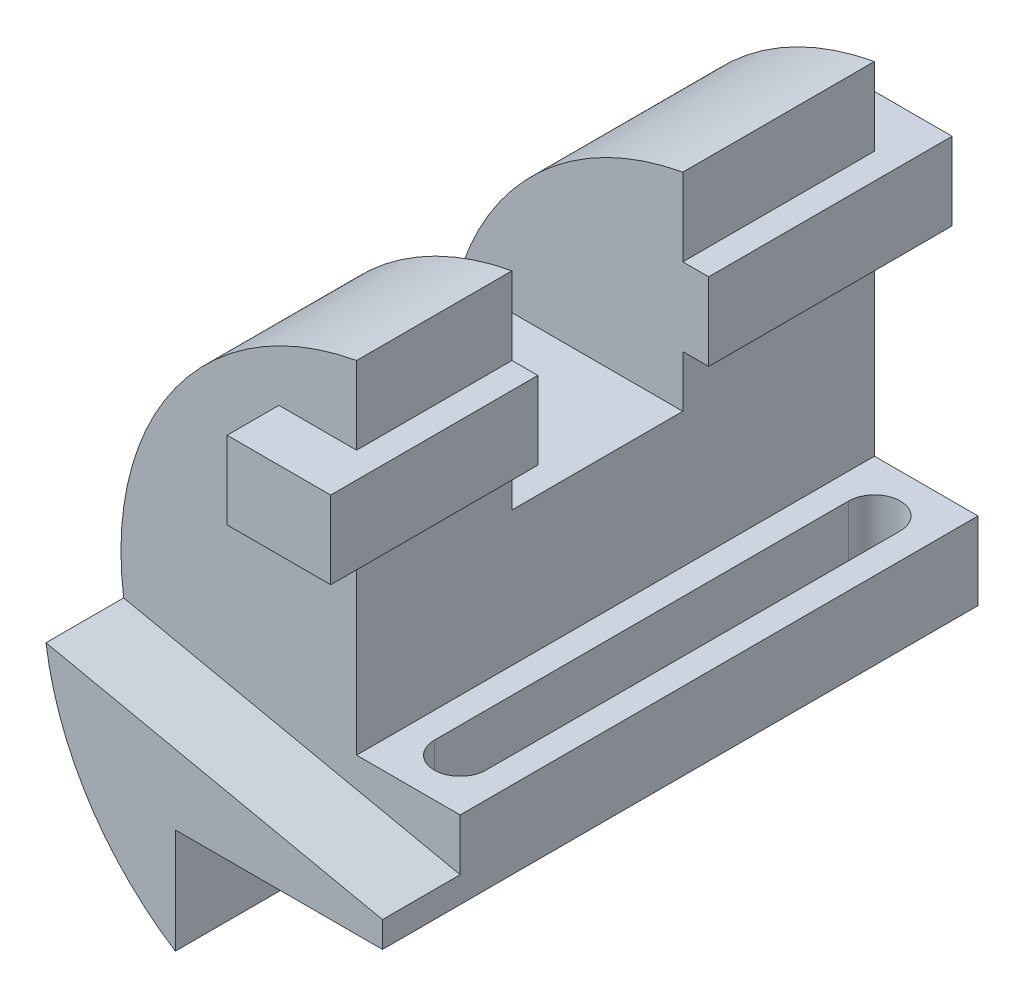
ISO-10303-21;
HEADER;
FILE_DESCRIPTION(('STEP AP214'),'2;1');
FILE_NAME('part.step','',(''),(''),'','','');
FILE_SCHEMA(('AUTOMOTIVE_DESIGN { 1 0 10303 214 1 1 1 1 }'));
ENDSEC;
DATA;
#1=APPLICATION_CONTEXT('core data for automotive mechanical design processes');
#2=APPLICATION_PROTOCOL_DEFINITION('international standard','automotive_design',2000,#1);
#3=PRODUCT_CONTEXT('',#1,'mechanical');
#4=PRODUCT('Part','Part','',(#3));
#5=PRODUCT_RELATED_PRODUCT_CATEGORY('part','',(#4));
#6=PRODUCT_DEFINITION_FORMATION('','',#4);
#7=PRODUCT_DEFINITION_CONTEXT('part definition',#1,'design');
#8=PRODUCT_DEFINITION('design','',#6,#7);
#9=PRODUCT_DEFINITION_SHAPE('','',#8);
#10=(LENGTH_UNIT() NAMED_UNIT(*) SI_UNIT(.MILLI.,.METRE.));
#11=(NAMED_UNIT(*) PLANE_ANGLE_UNIT() SI_UNIT($,.RADIAN.));
#12=(NAMED_UNIT(*) SI_UNIT($,.STERADIAN.) SOLID_ANGLE_UNIT());
#13=UNCERTAINTY_MEASURE_WITH_UNIT(LENGTH_MEASURE(1.E-05),#10,'distance_accuracy_value','');
#14=(GEOMETRIC_REPRESENTATION_CONTEXT(3) GLOBAL_UNCERTAINTY_ASSIGNED_CONTEXT((#13)) GLOBAL_UNIT_ASSIGNED_CONTEXT((#10,
#11,#12)) REPRESENTATION_CONTEXT('',''));
#15=CARTESIAN_POINT('',(0.,0.,0.));
#16=DIRECTION('',(0.,0.,1.));
#17=DIRECTION('',(1.,0.,0.));
#18=AXIS2_PLACEMENT_3D('',#15,#16,#17);
#19=CARTESIAN_POINT('',(-20.,15.,115.));
#20=DIRECTION('',(-1.,0.,0.));
#21=DIRECTION('',(0.,0.,1.));
#22=AXIS2_PLACEMENT_3D('',#19,#20,#21);
#23=PLANE('',#22);
#24=DIRECTION('',(0.,0.,1.));
#25=VECTOR('',#24,1.);
#26=CARTESIAN_POINT('',(-20.,66.,115.));
#27=LINE('',#26,#25);
#28=CARTESIAN_POINT('',(-20.,66.,70.));
#29=VERTEX_POINT('',#28);
#30=CARTESIAN_POINT('',(-20.,66.,100.));
#31=VERTEX_POINT('',#30);
#32=EDGE_CURVE('E317',#29,#31,#27,.T.);
#33=ORIENTED_EDGE('',*,*,#32,.F.);
#34=DIRECTION('',(0.,1.,0.));
#35=VECTOR('',#34,1.);
#36=CARTESIAN_POINT('',(-20.,15.,70.));
#37=LINE('',#36,#35);
#38=CARTESIAN_POINT('',(-20.,81.,70.));
#39=VERTEX_POINT('',#38);
#40=EDGE_CURVE('E267',#29,#39,#37,.T.);
#41=ORIENTED_EDGE('',*,*,#40,.T.);
#42=DIRECTION('',(0.,0.,-1.));
#43=VECTOR('',#42,1.);
#44=CARTESIAN_POINT('',(-20.,81.,115.));
#45=LINE('',#44,#43);
#46=CARTESIAN_POINT('',(-20.,81.,100.));
#47=VERTEX_POINT('',#46);
#48=EDGE_CURVE('E390',#47,#39,#45,.T.);
#49=ORIENTED_EDGE('',*,*,#48,.F.);
#50=DIRECTION('',(0.,1.,0.));
#51=VECTOR('',#50,1.);
#52=CARTESIAN_POINT('',(-20.,15.,100.));
#53=LINE('',#52,#51);
#54=EDGE_CURVE('E340',#31,#47,#53,.T.);
#55=ORIENTED_EDGE('',*,*,#54,.F.);
#56=EDGE_LOOP('',(#33,#41,#49,#55));
#57=FACE_BOUND('',#56,.T.);
#58=ADVANCED_FACE('F41',(#57),#23,.F.);
#59=CARTESIAN_POINT('',(-15.,66.,-10.));
#60=DIRECTION('',(-1.,0.,0.));
#61=DIRECTION('',(0.,0.,1.));
#62=AXIS2_PLACEMENT_3D('',#59,#60,#61);
#63=PLANE('',#62);
#64=DIRECTION('',(0.,1.,0.));
#65=VECTOR('',#64,1.);
#66=CARTESIAN_POINT('',(-15.,66.,110.));
#67=LINE('',#66,#65);
#68=CARTESIAN_POINT('',(-15.,51.,110.));
#69=VERTEX_POINT('',#68);
#70=CARTESIAN_POINT('',(-15.,66.,110.));
#71=VERTEX_POINT('',#70);
#72=EDGE_CURVE('E288',#69,#71,#67,.T.);
#73=ORIENTED_EDGE('',*,*,#72,.F.);
#74=DIRECTION('',(0.,0.,1.));
#75=VECTOR('',#74,1.);
#76=CARTESIAN_POINT('',(-15.,51.,-10.));
#77=LINE('',#76,#75);
#78=CARTESIAN_POINT('',(-15.,51.,70.));
#79=VERTEX_POINT('',#78);
#80=EDGE_CURVE('E314',#79,#69,#77,.T.);
#81=ORIENTED_EDGE('',*,*,#80,.F.);
#82=DIRECTION('',(0.,1.,0.));
#83=VECTOR('',#82,1.);
#84=CARTESIAN_POINT('',(-15.,66.,70.));
#85=LINE('',#84,#83);
#86=CARTESIAN_POINT('',(-15.,66.,70.));
#87=VERTEX_POINT('',#86);
#88=EDGE_CURVE('E264',#79,#87,#85,.T.);
#89=ORIENTED_EDGE('',*,*,#88,.T.);
#90=DIRECTION('',(0.,0.,1.));
#91=VECTOR('',#90,1.);
#92=CARTESIAN_POINT('',(-15.,66.,-10.));
#93=LINE('',#92,#91);
#94=EDGE_CURVE('E303',#87,#71,#93,.T.);
#95=ORIENTED_EDGE('',*,*,#94,.T.);
#96=EDGE_LOOP('',(#73,#81,#89,#95));
#97=FACE_BOUND('',#96,.T.);
#98=ADVANCED_FACE('F440',(#97),#63,.F.);
#99=CARTESIAN_POINT('',(-15.,51.,-10.));
#100=DIRECTION('',(0.,1.,0.));
#101=DIRECTION('',(-1.,0.,0.));
#102=AXIS2_PLACEMENT_3D('',#99,#100,#101);
#103=PLANE('',#102);
#104=DIRECTION('',(0.,0.,-1.));
#105=VECTOR('',#104,1.);
#106=CARTESIAN_POINT('',(-20.,51.,115.));
#107=LINE('',#106,#105);
#108=CARTESIAN_POINT('',(-20.,51.,100.));
#109=VERTEX_POINT('',#108);
#110=CARTESIAN_POINT('',(-20.,51.,70.));
#111=VERTEX_POINT('',#110);
#112=EDGE_CURVE('E328',#109,#111,#107,.T.);
#113=ORIENTED_EDGE('',*,*,#112,.T.);
#114=DIRECTION('',(1.,0.,0.));
#115=VECTOR('',#114,1.);
#116=CARTESIAN_POINT('',(-15.,51.,70.));
#117=LINE('',#116,#115);
#118=EDGE_CURVE('E270',#111,#79,#117,.T.);
#119=ORIENTED_EDGE('',*,*,#118,.T.);
#120=ORIENTED_EDGE('',*,*,#80,.T.);
#121=DIRECTION('',(1.,0.,0.));
#122=VECTOR('',#121,1.);
#123=CARTESIAN_POINT('',(-15.,51.,110.));
#124=LINE('',#123,#122);
#125=CARTESIAN_POINT('',(-35.,51.,110.));
#126=VERTEX_POINT('',#125);
#127=EDGE_CURVE('E291',#126,#69,#124,.T.);
#128=ORIENTED_EDGE('',*,*,#127,.F.);
#129=DIRECTION('',(0.,0.,1.));
#130=VECTOR('',#129,1.);
#131=CARTESIAN_POINT('',(-35.,51.,-10.));
#132=LINE('',#131,#130);
#133=CARTESIAN_POINT('',(-35.,51.,100.));
#134=VERTEX_POINT('',#133);
#135=EDGE_CURVE('E310',#134,#126,#132,.T.);
#136=ORIENTED_EDGE('',*,*,#135,.F.);
#137=DIRECTION('',(-1.,0.,0.));
#138=VECTOR('',#137,1.);
#139=CARTESIAN_POINT('',(-10.,51.,100.));
#140=LINE('',#139,#138);
#141=EDGE_CURVE('E403',#109,#134,#140,.T.);
#142=ORIENTED_EDGE('',*,*,#141,.F.);
#143=EDGE_LOOP('',(#113,#119,#120,#128,#136,#142));
#144=FACE_BOUND('',#143,.T.);
#145=ADVANCED_FACE('F450',(#144),#103,.F.);
#146=CARTESIAN_POINT('',(-15.,66.,-10.));
#147=DIRECTION('',(0.,-1.,0.));
#148=DIRECTION('',(0.,0.,-1.));
#149=AXIS2_PLACEMENT_3D('',#146,#147,#148);
#150=PLANE('',#149);
#151=ORIENTED_EDGE('',*,*,#94,.F.);
#152=DIRECTION('',(-1.,0.,0.));
#153=VECTOR('',#152,1.);
#154=CARTESIAN_POINT('',(-15.,66.,70.));
#155=LINE('',#154,#153);
#156=EDGE_CURVE('E409',#87,#29,#155,.T.);
#157=ORIENTED_EDGE('',*,*,#156,.T.);
#158=ORIENTED_EDGE('',*,*,#32,.T.);
#159=DIRECTION('',(1.,0.,0.));
#160=VECTOR('',#159,1.);
#161=CARTESIAN_POINT('',(-10.,66.,100.));
#162=LINE('',#161,#160);
#163=CARTESIAN_POINT('',(-35.,66.,100.));
#164=VERTEX_POINT('',#163);
#165=EDGE_CURVE('E397',#164,#31,#162,.T.);
#166=ORIENTED_EDGE('',*,*,#165,.F.);
#167=DIRECTION('',(0.,0.,1.));
#168=VECTOR('',#167,1.);
#169=CARTESIAN_POINT('',(-35.,66.,-10.));
#170=LINE('',#169,#168);
#171=CARTESIAN_POINT('',(-35.,66.,110.));
#172=VERTEX_POINT('',#171);
#173=EDGE_CURVE('E306',#164,#172,#170,.T.);
#174=ORIENTED_EDGE('',*,*,#173,.T.);
#175=DIRECTION('',(-1.,0.,0.));
#176=VECTOR('',#175,1.);
#177=CARTESIAN_POINT('',(-15.,66.,110.));
#178=LINE('',#177,#176);
#179=EDGE_CURVE('E285',#71,#172,#178,.T.);
#180=ORIENTED_EDGE('',*,*,#179,.F.);
#181=EDGE_LOOP('',(#151,#157,#158,#166,#174,#180));
#182=FACE_BOUND('',#181,.T.);
#183=ADVANCED_FACE('F459',(#182),#150,.F.);
#184=DIRECTION('',(0.,0.,1.));
#185=VECTOR('',#184,1.);
#186=CARTESIAN_POINT('',(-20.,41.,115.));
#187=LINE('',#186,#185);
#188=CARTESIAN_POINT('',(-20.,41.,37.));
#189=VERTEX_POINT('',#188);
#190=CARTESIAN_POINT('',(-20.,41.,70.));
#191=VERTEX_POINT('',#190);
#192=EDGE_CURVE('E279',#189,#191,#187,.T.);
#193=ORIENTED_EDGE('',*,*,#192,.T.);
#194=DIRECTION('',(0.,1.,0.));
#195=VECTOR('',#194,1.);
#196=CARTESIAN_POINT('',(-20.,15.,70.));
#197=LINE('',#196,#195);
#198=EDGE_CURVE('E276',#191,#111,#197,.T.);
#199=ORIENTED_EDGE('',*,*,#198,.T.);
#200=ORIENTED_EDGE('',*,*,#112,.F.);
#201=CARTESIAN_POINT('',(-20.,15.,100.));
#202=VERTEX_POINT('',#201);
#203=EDGE_CURVE('E341',#202,#109,#53,.T.);
#204=ORIENTED_EDGE('',*,*,#203,.F.);
#205=DIRECTION('',(0.,0.,-1.));
#206=VECTOR('',#205,1.);
#207=CARTESIAN_POINT('',(-20.,15.,115.));
#208=LINE('',#207,#206);
#209=CARTESIAN_POINT('',(-20.,15.,0.));
#210=VERTEX_POINT('',#209);
#211=EDGE_CURVE('E393',#202,#210,#208,.T.);
#212=ORIENTED_EDGE('',*,*,#211,.T.);
#213=DIRECTION('',(0.,1.,0.));
#214=VECTOR('',#213,1.);
#215=CARTESIAN_POINT('',(-20.,15.,0.));
#216=LINE('',#215,#214);
#217=CARTESIAN_POINT('',(-20.,51.,0.));
#218=VERTEX_POINT('',#217);
#219=EDGE_CURVE('E373',#210,#218,#216,.T.);
#220=ORIENTED_EDGE('',*,*,#219,.T.);
#221=CARTESIAN_POINT('',(-20.,51.,37.));
#222=VERTEX_POINT('',#221);
#223=EDGE_CURVE('E327',#222,#218,#107,.T.);
#224=ORIENTED_EDGE('',*,*,#223,.F.);
#225=DIRECTION('',(0.,-1.,0.));
#226=VECTOR('',#225,1.);
#227=CARTESIAN_POINT('',(-20.,15.,37.));
#228=LINE('',#227,#226);
#229=EDGE_CURVE('E261',#222,#189,#228,.T.);
#230=ORIENTED_EDGE('',*,*,#229,.T.);
#231=EDGE_LOOP('',(#193,#199,#200,#204,#212,#220,#224,#230));
#232=FACE_BOUND('',#231,.T.);
#233=ADVANCED_FACE('F444',(#232),#23,.F.);
#234=CARTESIAN_POINT('',(-20.,81.,37.));
#235=VERTEX_POINT('',#234);
#236=CARTESIAN_POINT('',(-20.,81.,0.));
#237=VERTEX_POINT('',#236);
#238=EDGE_CURVE('E389',#235,#237,#45,.T.);
#239=ORIENTED_EDGE('',*,*,#238,.F.);
#240=DIRECTION('',(0.,-1.,0.));
#241=VECTOR('',#240,1.);
#242=CARTESIAN_POINT('',(-20.,15.,37.));
#243=LINE('',#242,#241);
#244=CARTESIAN_POINT('',(-20.,66.,37.));
#245=VERTEX_POINT('',#244);
#246=EDGE_CURVE('E252',#235,#245,#243,.T.);
#247=ORIENTED_EDGE('',*,*,#246,.T.);
#248=CARTESIAN_POINT('',(-20.,66.,0.));
#249=VERTEX_POINT('',#248);
#250=EDGE_CURVE('E318',#249,#245,#27,.T.);
#251=ORIENTED_EDGE('',*,*,#250,.F.);
#252=EDGE_CURVE('E372',#249,#237,#216,.T.);
#253=ORIENTED_EDGE('',*,*,#252,.T.);
#254=EDGE_LOOP('',(#239,#247,#251,#253));
#255=FACE_BOUND('',#254,.T.);
#256=ADVANCED_FACE('F443',(#255),#23,.F.);
#257=CARTESIAN_POINT('',(-10.,26.4083339693685,0.));
#258=DIRECTION('',(0.,0.,-1.));
#259=DIRECTION('',(-1.,0.,0.));
#260=AXIS2_PLACEMENT_3D('',#257,#258,#259);
#261=PLANE('',#260);
#262=DIRECTION('',(0.,-1.,0.));
#263=VECTOR('',#262,1.);
#264=CARTESIAN_POINT('',(-35.,26.4083339693685,0.));
#265=LINE('',#264,#263);
#266=CARTESIAN_POINT('',(-35.,66.,0.));
#267=VERTEX_POINT('',#266);
#268=CARTESIAN_POINT('',(-35.,51.,0.));
#269=VERTEX_POINT('',#268);
#270=EDGE_CURVE('E324',#267,#269,#265,.T.);
#271=ORIENTED_EDGE('',*,*,#270,.T.);
#272=DIRECTION('',(1.,0.,0.));
#273=VECTOR('',#272,1.);
#274=CARTESIAN_POINT('',(-10.,51.,0.));
#275=LINE('',#274,#273);
#276=EDGE_CURVE('E331',#269,#218,#275,.T.);
#277=ORIENTED_EDGE('',*,*,#276,.T.);
#278=ORIENTED_EDGE('',*,*,#219,.F.);
#279=DIRECTION('',(-1.,0.,0.));
#280=VECTOR('',#279,1.);
#281=CARTESIAN_POINT('',(0.,15.,0.));
#282=LINE('',#281,#280);
#283=CARTESIAN_POINT('',(0.,15.,0.));
#284=VERTEX_POINT('',#283);
#285=EDGE_CURVE('E369',#284,#210,#282,.T.);
#286=ORIENTED_EDGE('',*,*,#285,.F.);
#287=DIRECTION('',(0.,1.,0.));
#288=VECTOR('',#287,1.);
#289=CARTESIAN_POINT('',(0.,0.,0.));
#290=LINE('',#289,#288);
#291=CARTESIAN_POINT('',(0.,0.,0.));
#292=VERTEX_POINT('',#291);
#293=EDGE_CURVE('E355',#292,#284,#290,.T.);
#294=ORIENTED_EDGE('',*,*,#293,.F.);
#295=DIRECTION('',(1.,0.,0.));
#296=VECTOR('',#295,1.);
#297=CARTESIAN_POINT('',(0.,0.,0.));
#298=LINE('',#297,#296);
#299=CARTESIAN_POINT('',(-40.,0.,0.));
#300=VERTEX_POINT('',#299);
#301=EDGE_CURVE('E360',#300,#292,#298,.T.);
#302=ORIENTED_EDGE('',*,*,#301,.F.);
#303=DIRECTION('',(0.,1.,0.));
#304=VECTOR('',#303,1.);
#305=CARTESIAN_POINT('',(-40.,0.,0.));
#306=LINE('',#305,#304);
#307=CARTESIAN_POINT('',(-40.,-20.2848132794516,0.));
#308=VERTEX_POINT('',#307);
#309=EDGE_CURVE('E378',#308,#300,#306,.T.);
#310=ORIENTED_EDGE('',*,*,#309,.F.);
#311=CARTESIAN_POINT('',(-10.,26.4083339693685,0.));
#312=DIRECTION('',(0.,0.,1.));
#313=DIRECTION('',(-1.,0.,0.));
#314=AXIS2_PLACEMENT_3D('',#311,#312,#313);
#315=CIRCLE('',#314,55.5);
#316=EDGE_CURVE('E376',#237,#308,#315,.T.);
#317=ORIENTED_EDGE('',*,*,#316,.F.);
#318=ORIENTED_EDGE('',*,*,#252,.F.);
#319=DIRECTION('',(-1.,0.,0.));
#320=VECTOR('',#319,1.);
#321=CARTESIAN_POINT('',(-10.,66.,0.));
#322=LINE('',#321,#320);
#323=EDGE_CURVE('E321',#249,#267,#322,.T.);
#324=ORIENTED_EDGE('',*,*,#323,.T.);
#325=EDGE_LOOP('',(#271,#277,#278,#286,#294,#302,#310,#317,#318,#324));
#326=FACE_BOUND('',#325,.T.);
#327=ADVANCED_FACE('F457',(#326),#261,.T.);
#328=CARTESIAN_POINT('',(-10.,26.4083339693685,100.));
#329=DIRECTION('',(0.,0.,1.));
#330=DIRECTION('',(1.,0.,0.));
#331=AXIS2_PLACEMENT_3D('',#328,#329,#330);
#332=PLANE('',#331);
#333=ORIENTED_EDGE('',*,*,#203,.T.);
#334=ORIENTED_EDGE('',*,*,#141,.T.);
#335=DIRECTION('',(0.,1.,0.));
#336=VECTOR('',#335,1.);
#337=CARTESIAN_POINT('',(-35.,26.4083339693685,100.));
#338=LINE('',#337,#336);
#339=EDGE_CURVE('E400',#134,#164,#338,.T.);
#340=ORIENTED_EDGE('',*,*,#339,.T.);
#341=ORIENTED_EDGE('',*,*,#165,.T.);
#342=ORIENTED_EDGE('',*,*,#54,.T.);
#343=CARTESIAN_POINT('',(-10.,26.4083339693685,100.));
#344=DIRECTION('',(0.,0.,1.));
#345=DIRECTION('',(1.,0.,0.));
#346=AXIS2_PLACEMENT_3D('',#343,#344,#345);
#347=CIRCLE('',#346,55.5);
#348=CARTESIAN_POINT('',(-64.9776030366009,18.8114158870193,100.));
#349=VERTEX_POINT('',#348);
#350=EDGE_CURVE('E337',#47,#349,#347,.T.);
#351=ORIENTED_EDGE('',*,*,#350,.T.);
#352=DIRECTION('',(-0.978147600733806,0.207911690817756,0.));
#353=VECTOR('',#352,1.);
#354=CARTESIAN_POINT('',(0.,5.,100.));
#355=LINE('',#354,#353);
#356=CARTESIAN_POINT('',(0.,5.,100.));
#357=VERTEX_POINT('',#356);
#358=EDGE_CURVE('E335',#357,#349,#355,.T.);
#359=ORIENTED_EDGE('',*,*,#358,.F.);
#360=DIRECTION('',(0.,1.,0.));
#361=VECTOR('',#360,1.);
#362=CARTESIAN_POINT('',(0.,5.,100.));
#363=LINE('',#362,#361);
#364=CARTESIAN_POINT('',(0.,15.,100.));
#365=VERTEX_POINT('',#364);
#366=EDGE_CURVE('E346',#357,#365,#363,.T.);
#367=ORIENTED_EDGE('',*,*,#366,.T.);
#368=DIRECTION('',(-1.,0.,0.));
#369=VECTOR('',#368,1.);
#370=CARTESIAN_POINT('',(0.,15.,100.));
#371=LINE('',#370,#369);
#372=EDGE_CURVE('E344',#365,#202,#371,.T.);
#373=ORIENTED_EDGE('',*,*,#372,.T.);
#374=EDGE_LOOP('',(#333,#334,#340,#341,#342,#351,#359,#367,#373));
#375=FACE_BOUND('',#374,.T.);
#376=ADVANCED_FACE('F504',(#375),#332,.T.);
#377=CARTESIAN_POINT('',(0.,0.,115.));
#378=DIRECTION('',(-1.,0.,0.));
#379=DIRECTION('',(0.,0.,1.));
#380=AXIS2_PLACEMENT_3D('',#377,#378,#379);
#381=PLANE('',#380);
#382=DIRECTION('',(0.,0.,1.));
#383=VECTOR('',#382,1.);
#384=CARTESIAN_POINT('',(0.,5.,100.));
#385=LINE('',#384,#383);
#386=CARTESIAN_POINT('',(0.,5.,115.));
#387=VERTEX_POINT('',#386);
#388=EDGE_CURVE('E348',#357,#387,#385,.T.);
#389=ORIENTED_EDGE('',*,*,#388,.T.);
#390=DIRECTION('',(0.,1.,0.));
#391=VECTOR('',#390,1.);
#392=CARTESIAN_POINT('',(0.,0.,115.));
#393=LINE('',#392,#391);
#394=CARTESIAN_POINT('',(0.,0.,115.));
#395=VERTEX_POINT('',#394);
#396=EDGE_CURVE('E356',#395,#387,#393,.T.);
#397=ORIENTED_EDGE('',*,*,#396,.F.);
#398=DIRECTION('',(0.,0.,-1.));
#399=VECTOR('',#398,1.);
#400=CARTESIAN_POINT('',(0.,0.,115.));
#401=LINE('',#400,#399);
#402=EDGE_CURVE('E366',#395,#292,#401,.T.);
#403=ORIENTED_EDGE('',*,*,#402,.T.);
#404=ORIENTED_EDGE('',*,*,#293,.T.);
#405=DIRECTION('',(0.,0.,-1.));
#406=VECTOR('',#405,1.);
#407=CARTESIAN_POINT('',(0.,15.,115.));
#408=LINE('',#407,#406);
#409=EDGE_CURVE('E395',#365,#284,#408,.T.);
#410=ORIENTED_EDGE('',*,*,#409,.F.);
#411=ORIENTED_EDGE('',*,*,#366,.F.);
#412=EDGE_LOOP('',(#389,#397,#403,#404,#410,#411));
#413=FACE_BOUND('',#412,.T.);
#414=ADVANCED_FACE('F43',(#413),#381,.F.);
#415=CARTESIAN_POINT('',(0.,15.,115.));
#416=DIRECTION('',(0.,-1.,0.));
#417=DIRECTION('',(1.,0.,0.));
#418=AXIS2_PLACEMENT_3D('',#415,#416,#417);
#419=PLANE('',#418);
#420=DIRECTION('',(0.,0.,-1.));
#421=VECTOR('',#420,1.);
#422=CARTESIAN_POINT('',(-15.,15.,115.));
#423=LINE('',#422,#421);
#424=CARTESIAN_POINT('',(-15.,15.,90.));
#425=VERTEX_POINT('',#424);
#426=CARTESIAN_POINT('',(-15.,15.,10.));
#427=VERTEX_POINT('',#426);
#428=EDGE_CURVE('E216',#425,#427,#423,.T.);
#429=ORIENTED_EDGE('',*,*,#428,.T.);
#430=CARTESIAN_POINT('',(-10.,15.,10.));
#431=DIRECTION('',(0.,-1.,0.));
#432=DIRECTION('',(1.,0.,0.));
#433=AXIS2_PLACEMENT_3D('',#430,#431,#432);
#434=CIRCLE('',#433,5.);
#435=CARTESIAN_POINT('',(-4.99999999999999,15.,10.));
#436=VERTEX_POINT('',#435);
#437=EDGE_CURVE('E237',#427,#436,#434,.T.);
#438=ORIENTED_EDGE('',*,*,#437,.T.);
#439=DIRECTION('',(0.,0.,-1.));
#440=VECTOR('',#439,1.);
#441=CARTESIAN_POINT('',(-5.00000000000001,15.,115.));
#442=LINE('',#441,#440);
#443=CARTESIAN_POINT('',(-5.,15.,90.));
#444=VERTEX_POINT('',#443);
#445=EDGE_CURVE('E236',#444,#436,#442,.T.);
#446=ORIENTED_EDGE('',*,*,#445,.F.);
#447=CARTESIAN_POINT('',(-10.,15.,90.));
#448=DIRECTION('',(0.,-1.,0.));
#449=DIRECTION('',(1.,0.,0.));
#450=AXIS2_PLACEMENT_3D('',#447,#448,#449);
#451=CIRCLE('',#450,5.);
#452=EDGE_CURVE('E227',#444,#425,#451,.T.);
#453=ORIENTED_EDGE('',*,*,#452,.T.);
#454=EDGE_LOOP('',(#429,#438,#446,#453));
#455=FACE_BOUND('',#454,.T.);
#456=ORIENTED_EDGE('',*,*,#372,.F.);
#457=ORIENTED_EDGE('',*,*,#409,.T.);
#458=ORIENTED_EDGE('',*,*,#285,.T.);
#459=ORIENTED_EDGE('',*,*,#211,.F.);
#460=EDGE_LOOP('',(#456,#457,#458,#459));
#461=FACE_BOUND('',#460,.T.);
#462=ADVANCED_FACE('F234',(#455,#461),#419,.F.);
#463=CARTESIAN_POINT('',(-10.,26.4083339693685,115.));
#464=DIRECTION('',(0.,0.,-1.));
#465=DIRECTION('',(-1.,0.,0.));
#466=AXIS2_PLACEMENT_3D('',#463,#464,#465);
#467=CYLINDRICAL_SURFACE('',#466,55.5);
#468=ORIENTED_EDGE('',*,*,#48,.T.);
#469=CARTESIAN_POINT('',(-10.,26.4083339693685,70.));
#470=DIRECTION('',(0.,0.,1.));
#471=DIRECTION('',(1.,0.,0.));
#472=AXIS2_PLACEMENT_3D('',#469,#470,#471);
#473=CIRCLE('',#472,55.5);
#474=CARTESIAN_POINT('',(-63.5474862383895,41.,70.));
#475=VERTEX_POINT('',#474);
#476=EDGE_CURVE('E273',#39,#475,#473,.T.);
#477=ORIENTED_EDGE('',*,*,#476,.T.);
#478=DIRECTION('',(0.,0.,-1.));
#479=VECTOR('',#478,1.);
#480=CARTESIAN_POINT('',(-63.5474862383895,41.,115.));
#481=LINE('',#480,#479);
#482=CARTESIAN_POINT('',(-63.5474862383895,41.,37.));
#483=VERTEX_POINT('',#482);
#484=EDGE_CURVE('E412',#475,#483,#481,.T.);
#485=ORIENTED_EDGE('',*,*,#484,.T.);
#486=CARTESIAN_POINT('',(-10.,26.4083339693685,37.));
#487=DIRECTION('',(0.,0.,-1.));
#488=DIRECTION('',(-1.,0.,0.));
#489=AXIS2_PLACEMENT_3D('',#486,#487,#488);
#490=CIRCLE('',#489,55.5);
#491=EDGE_CURVE('E258',#483,#235,#490,.T.);
#492=ORIENTED_EDGE('',*,*,#491,.T.);
#493=ORIENTED_EDGE('',*,*,#238,.T.);
#494=ORIENTED_EDGE('',*,*,#316,.T.);
#495=DIRECTION('',(0.,0.,-1.));
#496=VECTOR('',#495,1.);
#497=CARTESIAN_POINT('',(-40.,-20.2848132794516,115.));
#498=LINE('',#497,#496);
#499=CARTESIAN_POINT('',(-40.,-20.2848132794516,115.));
#500=VERTEX_POINT('',#499);
#501=EDGE_CURVE('E386',#500,#308,#498,.T.);
#502=ORIENTED_EDGE('',*,*,#501,.F.);
#503=CARTESIAN_POINT('',(-10.,26.4083339693685,115.));
#504=DIRECTION('',(0.,0.,1.));
#505=DIRECTION('',(-1.,0.,0.));
#506=AXIS2_PLACEMENT_3D('',#503,#504,#505);
#507=CIRCLE('',#506,55.5);
#508=CARTESIAN_POINT('',(-64.977603036601,18.8114158870193,115.));
#509=VERTEX_POINT('',#508);
#510=EDGE_CURVE('E359',#509,#500,#507,.T.);
#511=ORIENTED_EDGE('',*,*,#510,.F.);
#512=DIRECTION('',(0.,0.,1.));
#513=VECTOR('',#512,1.);
#514=CARTESIAN_POINT('',(-64.9776030366009,18.8114158870193,100.));
#515=LINE('',#514,#513);
#516=EDGE_CURVE('E353',#349,#509,#515,.T.);
#517=ORIENTED_EDGE('',*,*,#516,.F.);
#518=ORIENTED_EDGE('',*,*,#350,.F.);
#519=EDGE_LOOP('',(#468,#477,#485,#492,#493,#494,#502,#511,#517,#518));
#520=FACE_BOUND('',#519,.T.);
#521=ADVANCED_FACE('F478',(#520),#467,.T.);
#522=CARTESIAN_POINT('',(-10.,26.4083339693685,115.));
#523=DIRECTION('',(0.,0.,-1.));
#524=DIRECTION('',(-1.,0.,0.));
#525=AXIS2_PLACEMENT_3D('',#522,#523,#524);
#526=PLANE('',#525);
#527=DIRECTION('',(-0.978147600733806,0.207911690817756,0.));
#528=VECTOR('',#527,1.);
#529=CARTESIAN_POINT('',(0.,5.,115.));
#530=LINE('',#529,#528);
#531=EDGE_CURVE('E334',#387,#509,#530,.T.);
#532=ORIENTED_EDGE('',*,*,#531,.T.);
#533=ORIENTED_EDGE('',*,*,#510,.T.);
#534=DIRECTION('',(0.,1.,0.));
#535=VECTOR('',#534,1.);
#536=CARTESIAN_POINT('',(-40.,0.,115.));
#537=LINE('',#536,#535);
#538=CARTESIAN_POINT('',(-40.,0.,115.));
#539=VERTEX_POINT('',#538);
#540=EDGE_CURVE('E362',#500,#539,#537,.T.);
#541=ORIENTED_EDGE('',*,*,#540,.T.);
#542=DIRECTION('',(1.,0.,0.));
#543=VECTOR('',#542,1.);
#544=CARTESIAN_POINT('',(0.,0.,115.));
#545=LINE('',#544,#543);
#546=EDGE_CURVE('E364',#539,#395,#545,.T.);
#547=ORIENTED_EDGE('',*,*,#546,.T.);
#548=ORIENTED_EDGE('',*,*,#396,.T.);
#549=EDGE_LOOP('',(#532,#533,#541,#547,#548));
#550=FACE_BOUND('',#549,.T.);
#551=ADVANCED_FACE('F494',(#550),#526,.F.);
#552=CARTESIAN_POINT('',(-40.,0.,115.));
#553=DIRECTION('',(-1.,0.,0.));
#554=DIRECTION('',(0.,-1.,0.));
#555=AXIS2_PLACEMENT_3D('',#552,#553,#554);
#556=PLANE('',#555);
#557=ORIENTED_EDGE('',*,*,#309,.T.);
#558=DIRECTION('',(0.,0.,-1.));
#559=VECTOR('',#558,1.);
#560=CARTESIAN_POINT('',(-40.,0.,115.));
#561=LINE('',#560,#559);
#562=EDGE_CURVE('E383',#539,#300,#561,.T.);
#563=ORIENTED_EDGE('',*,*,#562,.F.);
#564=ORIENTED_EDGE('',*,*,#540,.F.);
#565=ORIENTED_EDGE('',*,*,#501,.T.);
#566=EDGE_LOOP('',(#557,#563,#564,#565));
#567=FACE_BOUND('',#566,.T.);
#568=ADVANCED_FACE('F490',(#567),#556,.F.);
#569=CARTESIAN_POINT('',(0.,0.,115.));
#570=DIRECTION('',(0.,1.,0.));
#571=DIRECTION('',(0.,0.,1.));
#572=AXIS2_PLACEMENT_3D('',#569,#570,#571);
#573=PLANE('',#572);
#574=DIRECTION('',(0.,0.,1.));
#575=VECTOR('',#574,1.);
#576=CARTESIAN_POINT('',(-5.,0.,115.));
#577=LINE('',#576,#575);
#578=CARTESIAN_POINT('',(-4.99999999999999,0.,10.));
#579=VERTEX_POINT('',#578);
#580=CARTESIAN_POINT('',(-5.,0.,90.));
#581=VERTEX_POINT('',#580);
#582=EDGE_CURVE('E12',#579,#581,#577,.T.);
#583=ORIENTED_EDGE('',*,*,#582,.F.);
#584=CARTESIAN_POINT('',(-9.99999999999999,0.,10.));
#585=DIRECTION('',(0.,1.,0.));
#586=DIRECTION('',(0.,0.,1.));
#587=AXIS2_PLACEMENT_3D('',#584,#585,#586);
#588=CIRCLE('',#587,5.);
#589=CARTESIAN_POINT('',(-15.,0.,10.));
#590=VERTEX_POINT('',#589);
#591=EDGE_CURVE('E221',#579,#590,#588,.T.);
#592=ORIENTED_EDGE('',*,*,#591,.T.);
#593=DIRECTION('',(0.,0.,1.));
#594=VECTOR('',#593,1.);
#595=CARTESIAN_POINT('',(-15.,0.,115.));
#596=LINE('',#595,#594);
#597=CARTESIAN_POINT('',(-15.,0.,90.));
#598=VERTEX_POINT('',#597);
#599=EDGE_CURVE('E222',#590,#598,#596,.T.);
#600=ORIENTED_EDGE('',*,*,#599,.T.);
#601=CARTESIAN_POINT('',(-10.,0.,90.));
#602=DIRECTION('',(0.,1.,0.));
#603=DIRECTION('',(0.,0.,1.));
#604=AXIS2_PLACEMENT_3D('',#601,#602,#603);
#605=CIRCLE('',#604,5.);
#606=EDGE_CURVE('E49',#598,#581,#605,.T.);
#607=ORIENTED_EDGE('',*,*,#606,.T.);
#608=EDGE_LOOP('',(#583,#592,#600,#607));
#609=FACE_BOUND('',#608,.T.);
#610=ORIENTED_EDGE('',*,*,#301,.T.);
#611=ORIENTED_EDGE('',*,*,#402,.F.);
#612=ORIENTED_EDGE('',*,*,#546,.F.);
#613=ORIENTED_EDGE('',*,*,#562,.T.);
#614=EDGE_LOOP('',(#610,#611,#612,#613));
#615=FACE_BOUND('',#614,.T.);
#616=ADVANCED_FACE('F416',(#609,#615),#573,.F.);
#617=CARTESIAN_POINT('',(0.,5.,100.));
#618=DIRECTION('',(0.207911690817756,0.978147600733806,0.));
#619=DIRECTION('',(-0.978147600733806,0.207911690817756,0.));
#620=AXIS2_PLACEMENT_3D('',#617,#618,#619);
#621=PLANE('',#620);
#622=ORIENTED_EDGE('',*,*,#531,.F.);
#623=ORIENTED_EDGE('',*,*,#388,.F.);
#624=ORIENTED_EDGE('',*,*,#358,.T.);
#625=ORIENTED_EDGE('',*,*,#516,.T.);
#626=EDGE_LOOP('',(#622,#623,#624,#625));
#627=FACE_BOUND('',#626,.T.);
#628=ADVANCED_FACE('F500',(#627),#621,.T.);
#629=CARTESIAN_POINT('',(-35.,66.,-10.));
#630=DIRECTION('',(1.,0.,0.));
#631=DIRECTION('',(0.,0.,-1.));
#632=AXIS2_PLACEMENT_3D('',#629,#630,#631);
#633=PLANE('',#632);
#634=ORIENTED_EDGE('',*,*,#270,.F.);
#635=CARTESIAN_POINT('',(-35.,66.,-10.));
#636=VERTEX_POINT('',#635);
#637=EDGE_CURVE('E307',#636,#267,#170,.T.);
#638=ORIENTED_EDGE('',*,*,#637,.F.);
#639=DIRECTION('',(0.,1.,0.));
#640=VECTOR('',#639,1.);
#641=CARTESIAN_POINT('',(-35.,66.,-10.));
#642=LINE('',#641,#640);
#643=CARTESIAN_POINT('',(-35.,51.,-10.));
#644=VERTEX_POINT('',#643);
#645=EDGE_CURVE('E299',#644,#636,#642,.T.);
#646=ORIENTED_EDGE('',*,*,#645,.F.);
#647=EDGE_CURVE('E311',#644,#269,#132,.T.);
#648=ORIENTED_EDGE('',*,*,#647,.T.);
#649=EDGE_LOOP('',(#634,#638,#646,#648));
#650=FACE_BOUND('',#649,.T.);
#651=ADVANCED_FACE('F540',(#650),#633,.F.);
#652=DIRECTION('',(0.,-1.,0.));
#653=VECTOR('',#652,1.);
#654=CARTESIAN_POINT('',(-15.,66.,37.));
#655=LINE('',#654,#653);
#656=CARTESIAN_POINT('',(-15.,66.,37.));
#657=VERTEX_POINT('',#656);
#658=CARTESIAN_POINT('',(-15.,51.,37.));
#659=VERTEX_POINT('',#658);
#660=EDGE_CURVE('E247',#657,#659,#655,.T.);
#661=ORIENTED_EDGE('',*,*,#660,.T.);
#662=CARTESIAN_POINT('',(-15.,51.,-10.));
#663=VERTEX_POINT('',#662);
#664=EDGE_CURVE('E315',#663,#659,#77,.T.);
#665=ORIENTED_EDGE('',*,*,#664,.F.);
#666=DIRECTION('',(0.,-1.,0.));
#667=VECTOR('',#666,1.);
#668=CARTESIAN_POINT('',(-15.,66.,-10.));
#669=LINE('',#668,#667);
#670=CARTESIAN_POINT('',(-15.,66.,-10.));
#671=VERTEX_POINT('',#670);
#672=EDGE_CURVE('E294',#671,#663,#669,.T.);
#673=ORIENTED_EDGE('',*,*,#672,.F.);
#674=EDGE_CURVE('E304',#671,#657,#93,.T.);
#675=ORIENTED_EDGE('',*,*,#674,.T.);
#676=EDGE_LOOP('',(#661,#665,#673,#675));
#677=FACE_BOUND('',#676,.T.);
#678=ADVANCED_FACE('F453',(#677),#63,.F.);
#679=ORIENTED_EDGE('',*,*,#664,.T.);
#680=DIRECTION('',(-1.,0.,0.));
#681=VECTOR('',#680,1.);
#682=CARTESIAN_POINT('',(-15.,51.,37.));
#683=LINE('',#682,#681);
#684=EDGE_CURVE('E255',#659,#222,#683,.T.);
#685=ORIENTED_EDGE('',*,*,#684,.T.);
#686=ORIENTED_EDGE('',*,*,#223,.T.);
#687=ORIENTED_EDGE('',*,*,#276,.F.);
#688=ORIENTED_EDGE('',*,*,#647,.F.);
#689=DIRECTION('',(-1.,0.,0.));
#690=VECTOR('',#689,1.);
#691=CARTESIAN_POINT('',(-15.,51.,-10.));
#692=LINE('',#691,#690);
#693=EDGE_CURVE('E297',#663,#644,#692,.T.);
#694=ORIENTED_EDGE('',*,*,#693,.F.);
#695=EDGE_LOOP('',(#679,#685,#686,#687,#688,#694));
#696=FACE_BOUND('',#695,.T.);
#697=ADVANCED_FACE('F529',(#696),#103,.F.);
#698=ORIENTED_EDGE('',*,*,#339,.F.);
#699=ORIENTED_EDGE('',*,*,#135,.T.);
#700=DIRECTION('',(0.,-1.,0.));
#701=VECTOR('',#700,1.);
#702=CARTESIAN_POINT('',(-35.,66.,110.));
#703=LINE('',#702,#701);
#704=EDGE_CURVE('E282',#172,#126,#703,.T.);
#705=ORIENTED_EDGE('',*,*,#704,.F.);
#706=ORIENTED_EDGE('',*,*,#173,.F.);
#707=EDGE_LOOP('',(#698,#699,#705,#706));
#708=FACE_BOUND('',#707,.T.);
#709=ADVANCED_FACE('F519',(#708),#633,.F.);
#710=ORIENTED_EDGE('',*,*,#250,.T.);
#711=DIRECTION('',(1.,0.,0.));
#712=VECTOR('',#711,1.);
#713=CARTESIAN_POINT('',(-15.,66.,37.));
#714=LINE('',#713,#712);
#715=EDGE_CURVE('E406',#245,#657,#714,.T.);
#716=ORIENTED_EDGE('',*,*,#715,.T.);
#717=ORIENTED_EDGE('',*,*,#674,.F.);
#718=DIRECTION('',(1.,0.,0.));
#719=VECTOR('',#718,1.);
#720=CARTESIAN_POINT('',(-15.,66.,-10.));
#721=LINE('',#720,#719);
#722=EDGE_CURVE('E301',#636,#671,#721,.T.);
#723=ORIENTED_EDGE('',*,*,#722,.F.);
#724=ORIENTED_EDGE('',*,*,#637,.T.);
#725=ORIENTED_EDGE('',*,*,#323,.F.);
#726=EDGE_LOOP('',(#710,#716,#717,#723,#724,#725));
#727=FACE_BOUND('',#726,.T.);
#728=ADVANCED_FACE('F466',(#727),#150,.F.);
#729=CARTESIAN_POINT('',(0.,0.,-10.));
#730=DIRECTION('',(0.,0.,-1.));
#731=DIRECTION('',(-1.,0.,0.));
#732=AXIS2_PLACEMENT_3D('',#729,#730,#731);
#733=PLANE('',#732);
#734=ORIENTED_EDGE('',*,*,#672,.T.);
#735=ORIENTED_EDGE('',*,*,#693,.T.);
#736=ORIENTED_EDGE('',*,*,#645,.T.);
#737=ORIENTED_EDGE('',*,*,#722,.T.);
#738=EDGE_LOOP('',(#734,#735,#736,#737));
#739=FACE_BOUND('',#738,.T.);
#740=ADVANCED_FACE('F543',(#739),#733,.T.);
#741=CARTESIAN_POINT('',(-10.,26.4083339693685,110.));
#742=DIRECTION('',(0.,0.,-1.));
#743=DIRECTION('',(-1.,0.,0.));
#744=AXIS2_PLACEMENT_3D('',#741,#742,#743);
#745=PLANE('',#744);
#746=ORIENTED_EDGE('',*,*,#72,.T.);
#747=ORIENTED_EDGE('',*,*,#179,.T.);
#748=ORIENTED_EDGE('',*,*,#704,.T.);
#749=ORIENTED_EDGE('',*,*,#127,.T.);
#750=EDGE_LOOP('',(#746,#747,#748,#749));
#751=FACE_BOUND('',#750,.T.);
#752=ADVANCED_FACE('F515',(#751),#745,.F.);
#753=CARTESIAN_POINT('',(-65.5,41.,70.));
#754=DIRECTION('',(0.,-1.,0.));
#755=DIRECTION('',(0.,0.,-1.));
#756=AXIS2_PLACEMENT_3D('',#753,#754,#755);
#757=PLANE('',#756);
#758=DIRECTION('',(1.,0.,0.));
#759=VECTOR('',#758,1.);
#760=CARTESIAN_POINT('',(-65.5,41.,37.));
#761=LINE('',#760,#759);
#762=EDGE_CURVE('E244',#483,#189,#761,.T.);
#763=ORIENTED_EDGE('',*,*,#762,.F.);
#764=ORIENTED_EDGE('',*,*,#484,.F.);
#765=DIRECTION('',(1.,0.,0.));
#766=VECTOR('',#765,1.);
#767=CARTESIAN_POINT('',(-65.5,41.,70.));
#768=LINE('',#767,#766);
#769=EDGE_CURVE('E239',#475,#191,#768,.T.);
#770=ORIENTED_EDGE('',*,*,#769,.T.);
#771=ORIENTED_EDGE('',*,*,#192,.F.);
#772=EDGE_LOOP('',(#763,#764,#770,#771));
#773=FACE_BOUND('',#772,.T.);
#774=ADVANCED_FACE('F471',(#773),#757,.F.);
#775=CARTESIAN_POINT('',(-65.5,81.,70.));
#776=DIRECTION('',(0.,0.,1.));
#777=DIRECTION('',(1.,0.,0.));
#778=AXIS2_PLACEMENT_3D('',#775,#776,#777);
#779=PLANE('',#778);
#780=ORIENTED_EDGE('',*,*,#769,.F.);
#781=ORIENTED_EDGE('',*,*,#476,.F.);
#782=ORIENTED_EDGE('',*,*,#40,.F.);
#783=ORIENTED_EDGE('',*,*,#156,.F.);
#784=ORIENTED_EDGE('',*,*,#88,.F.);
#785=ORIENTED_EDGE('',*,*,#118,.F.);
#786=ORIENTED_EDGE('',*,*,#198,.F.);
#787=EDGE_LOOP('',(#780,#781,#782,#783,#784,#785,#786));
#788=FACE_BOUND('',#787,.T.);
#789=ADVANCED_FACE('F507',(#788),#779,.F.);
#790=CARTESIAN_POINT('',(-65.5,81.,37.));
#791=DIRECTION('',(0.,0.,-1.));
#792=DIRECTION('',(-1.,0.,0.));
#793=AXIS2_PLACEMENT_3D('',#790,#791,#792);
#794=PLANE('',#793);
#795=ORIENTED_EDGE('',*,*,#684,.F.);
#796=ORIENTED_EDGE('',*,*,#660,.F.);
#797=ORIENTED_EDGE('',*,*,#715,.F.);
#798=ORIENTED_EDGE('',*,*,#246,.F.);
#799=ORIENTED_EDGE('',*,*,#491,.F.);
#800=ORIENTED_EDGE('',*,*,#762,.T.);
#801=ORIENTED_EDGE('',*,*,#229,.F.);
#802=EDGE_LOOP('',(#795,#796,#797,#798,#799,#800,#801));
#803=FACE_BOUND('',#802,.T.);
#804=ADVANCED_FACE('F475',(#803),#794,.F.);
#805=CARTESIAN_POINT('',(-4.99999999999999,-20.2848132794516,10.));
#806=DIRECTION('',(-1.,0.,0.));
#807=DIRECTION('',(0.,0.,1.));
#808=AXIS2_PLACEMENT_3D('',#805,#806,#807);
#809=PLANE('',#808);
#810=ORIENTED_EDGE('',*,*,#445,.T.);
#811=DIRECTION('',(0.,1.,0.));
#812=VECTOR('',#811,1.);
#813=CARTESIAN_POINT('',(-4.99999999999999,-20.2848132794516,10.));
#814=LINE('',#813,#812);
#815=EDGE_CURVE('E419',#579,#436,#814,.T.);
#816=ORIENTED_EDGE('',*,*,#815,.F.);
#817=ORIENTED_EDGE('',*,*,#582,.T.);
#818=DIRECTION('',(0.,1.,0.));
#819=VECTOR('',#818,1.);
#820=CARTESIAN_POINT('',(-5.,-20.2848132794516,90.));
#821=LINE('',#820,#819);
#822=EDGE_CURVE('E231',#581,#444,#821,.T.);
#823=ORIENTED_EDGE('',*,*,#822,.T.);
#824=EDGE_LOOP('',(#810,#816,#817,#823));
#825=FACE_BOUND('',#824,.T.);
#826=ADVANCED_FACE('F426',(#825),#809,.T.);
#827=CARTESIAN_POINT('',(-10.,-20.2848132794516,90.));
#828=DIRECTION('',(0.,1.,0.));
#829=DIRECTION('',(-1.,0.,0.));
#830=AXIS2_PLACEMENT_3D('',#827,#828,#829);
#831=CYLINDRICAL_SURFACE('',#830,5.);
#832=ORIENTED_EDGE('',*,*,#822,.F.);
#833=ORIENTED_EDGE('',*,*,#606,.F.);
#834=DIRECTION('',(0.,1.,0.));
#835=VECTOR('',#834,1.);
#836=CARTESIAN_POINT('',(-15.,-20.2848132794516,90.));
#837=LINE('',#836,#835);
#838=EDGE_CURVE('E61',#598,#425,#837,.T.);
#839=ORIENTED_EDGE('',*,*,#838,.T.);
#840=ORIENTED_EDGE('',*,*,#452,.F.);
#841=EDGE_LOOP('',(#832,#833,#839,#840));
#842=FACE_BOUND('',#841,.T.);
#843=ADVANCED_FACE('F226',(#842),#831,.F.);
#844=CARTESIAN_POINT('',(-9.99999999999999,-20.2848132794516,10.));
#845=DIRECTION('',(0.,1.,0.));
#846=DIRECTION('',(-1.,0.,0.));
#847=AXIS2_PLACEMENT_3D('',#844,#845,#846);
#848=CYLINDRICAL_SURFACE('',#847,5.);
#849=DIRECTION('',(0.,1.,0.));
#850=VECTOR('',#849,1.);
#851=CARTESIAN_POINT('',(-15.,-20.2848132794516,10.));
#852=LINE('',#851,#850);
#853=EDGE_CURVE('E56',#590,#427,#852,.T.);
#854=ORIENTED_EDGE('',*,*,#853,.F.);
#855=ORIENTED_EDGE('',*,*,#591,.F.);
#856=ORIENTED_EDGE('',*,*,#815,.T.);
#857=ORIENTED_EDGE('',*,*,#437,.F.);
#858=EDGE_LOOP('',(#854,#855,#856,#857));
#859=FACE_BOUND('',#858,.T.);
#860=ADVANCED_FACE('F429',(#859),#848,.F.);
#861=CARTESIAN_POINT('',(-15.,-20.2848132794516,10.));
#862=DIRECTION('',(-1.,0.,0.));
#863=DIRECTION('',(0.,0.,1.));
#864=AXIS2_PLACEMENT_3D('',#861,#862,#863);
#865=PLANE('',#864);
#866=ORIENTED_EDGE('',*,*,#838,.F.);
#867=ORIENTED_EDGE('',*,*,#599,.F.);
#868=ORIENTED_EDGE('',*,*,#853,.T.);
#869=ORIENTED_EDGE('',*,*,#428,.F.);
#870=EDGE_LOOP('',(#866,#867,#868,#869));
#871=FACE_BOUND('',#870,.T.);
#872=ADVANCED_FACE('F217',(#871),#865,.F.);
#873=CLOSED_SHELL('',(#58,#98,#145,#183,#233,#256,#327,#376,#414,#462,#521,#551,#568,#616,#628,
#651,#678,#697,#709,#728,#740,#752,#774,#789,#804,#826,#843,#860,#872));
#874=MANIFOLD_SOLID_BREP('B2',#873);
#875=ADVANCED_BREP_SHAPE_REPRESENTATION('',(#18,#874),#14);
#876=SHAPE_DEFINITION_REPRESENTATION(#9,#875);
ENDSEC;
END-ISO-10303-21;
